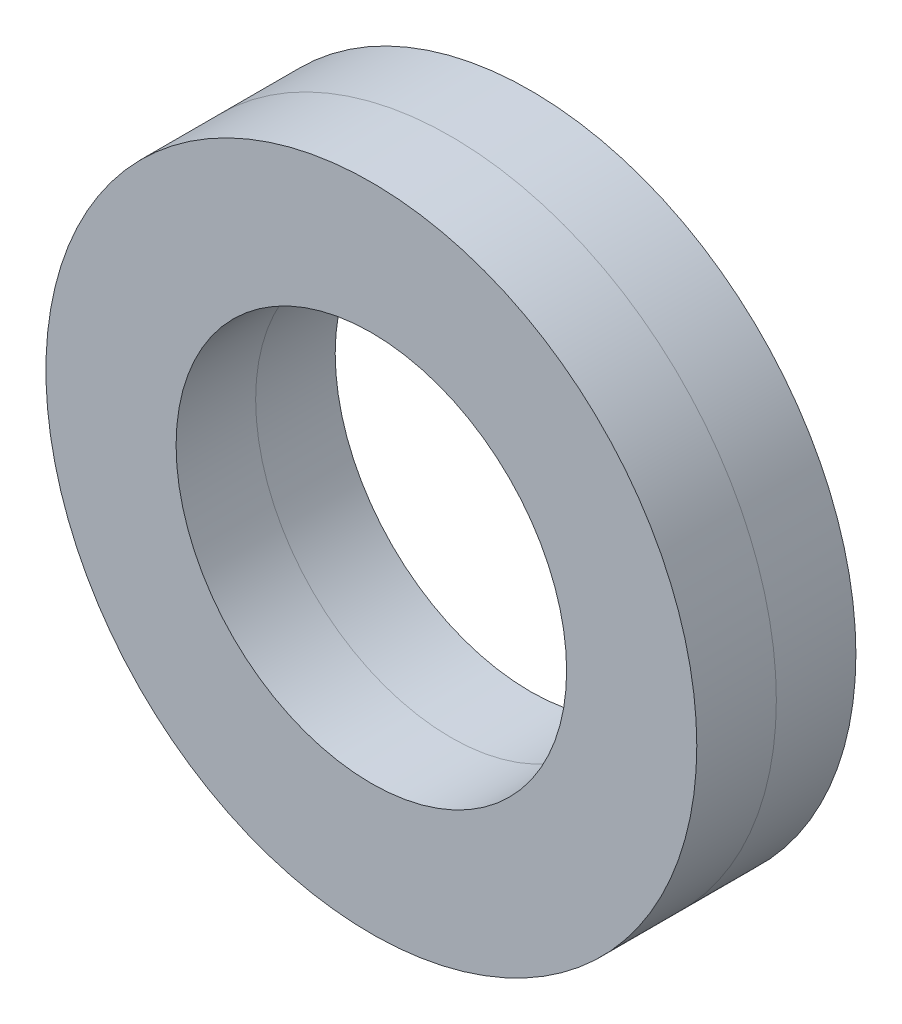
ISO-10303-21;
HEADER;
FILE_DESCRIPTION(('STEP AP214'),'2;1');
FILE_NAME('part.step','',(''),(''),'','','');
FILE_SCHEMA(('AUTOMOTIVE_DESIGN { 1 0 10303 214 1 1 1 1 }'));
ENDSEC;
DATA;
#1=APPLICATION_CONTEXT('core data for automotive mechanical design processes');
#2=APPLICATION_PROTOCOL_DEFINITION('international standard','automotive_design',2000,#1);
#3=PRODUCT_CONTEXT('',#1,'mechanical');
#4=PRODUCT('Part','Part','',(#3));
#5=PRODUCT_RELATED_PRODUCT_CATEGORY('part','',(#4));
#6=PRODUCT_DEFINITION_FORMATION('','',#4);
#7=PRODUCT_DEFINITION_CONTEXT('part definition',#1,'design');
#8=PRODUCT_DEFINITION('design','',#6,#7);
#9=PRODUCT_DEFINITION_SHAPE('','',#8);
#10=(LENGTH_UNIT() NAMED_UNIT(*) SI_UNIT(.MILLI.,.METRE.));
#11=(NAMED_UNIT(*) PLANE_ANGLE_UNIT() SI_UNIT($,.RADIAN.));
#12=(NAMED_UNIT(*) SI_UNIT($,.STERADIAN.) SOLID_ANGLE_UNIT());
#13=UNCERTAINTY_MEASURE_WITH_UNIT(LENGTH_MEASURE(1.E-05),#10,'distance_accuracy_value','');
#14=(GEOMETRIC_REPRESENTATION_CONTEXT(3) GLOBAL_UNCERTAINTY_ASSIGNED_CONTEXT((#13)) GLOBAL_UNIT_ASSIGNED_CONTEXT((#10,
#11,#12)) REPRESENTATION_CONTEXT('',''));
#15=CARTESIAN_POINT('',(0.,0.,0.));
#16=DIRECTION('',(0.,0.,1.));
#17=DIRECTION('',(1.,0.,0.));
#18=AXIS2_PLACEMENT_3D('',#15,#16,#17);
#19=CARTESIAN_POINT('',(0.,0.,0.));
#20=DIRECTION('',(0.,0.,1.));
#21=DIRECTION('',(1.,0.,0.));
#22=AXIS2_PLACEMENT_3D('',#19,#20,#21);
#23=CYLINDRICAL_SURFACE('',#22,2.7);
#24=CARTESIAN_POINT('',(0.,0.,0.));
#25=DIRECTION('',(0.,0.,1.));
#26=DIRECTION('',(1.,0.,0.));
#27=AXIS2_PLACEMENT_3D('',#24,#25,#26);
#28=CIRCLE('',#27,2.7);
#29=CARTESIAN_POINT('',(2.7,0.,0.));
#30=VERTEX_POINT('',#29);
#31=EDGE_CURVE('E78',#30,#30,#28,.T.);
#32=ORIENTED_EDGE('',*,*,#31,.T.);
#33=EDGE_LOOP('',(#32));
#34=FACE_BOUND('',#33,.T.);
#35=CARTESIAN_POINT('',(0.,0.,-1.1));
#36=DIRECTION('',(0.,0.,1.));
#37=DIRECTION('',(1.,0.,0.));
#38=AXIS2_PLACEMENT_3D('',#35,#36,#37);
#39=CIRCLE('',#38,2.7);
#40=CARTESIAN_POINT('',(2.7,0.,-1.1));
#41=VERTEX_POINT('',#40);
#42=EDGE_CURVE('E11',#41,#41,#39,.T.);
#43=ORIENTED_EDGE('',*,*,#42,.F.);
#44=EDGE_LOOP('',(#43));
#45=FACE_BOUND('',#44,.T.);
#46=ADVANCED_FACE('F57',(#34,#45),#23,.F.);
#47=CARTESIAN_POINT('',(0.,0.,-1.1));
#48=DIRECTION('',(0.,0.,-1.));
#49=DIRECTION('',(-1.,0.,0.));
#50=AXIS2_PLACEMENT_3D('',#47,#48,#49);
#51=PLANE('',#50);
#52=ORIENTED_EDGE('',*,*,#42,.T.);
#53=EDGE_LOOP('',(#52));
#54=FACE_BOUND('',#53,.T.);
#55=CARTESIAN_POINT('',(0.,0.,-1.1));
#56=DIRECTION('',(0.,0.,1.));
#57=DIRECTION('',(1.,0.,0.));
#58=AXIS2_PLACEMENT_3D('',#55,#56,#57);
#59=CIRCLE('',#58,4.5);
#60=CARTESIAN_POINT('',(4.5,0.,-1.1));
#61=VERTEX_POINT('',#60);
#62=EDGE_CURVE('E64',#61,#61,#59,.T.);
#63=ORIENTED_EDGE('',*,*,#62,.F.);
#64=EDGE_LOOP('',(#63));
#65=FACE_BOUND('',#64,.T.);
#66=ADVANCED_FACE('F97',(#54,#65),#51,.T.);
#67=CARTESIAN_POINT('',(0.,0.,0.));
#68=DIRECTION('',(0.,0.,1.));
#69=DIRECTION('',(1.,0.,0.));
#70=AXIS2_PLACEMENT_3D('',#67,#68,#69);
#71=CYLINDRICAL_SURFACE('',#70,4.5);
#72=ORIENTED_EDGE('',*,*,#62,.T.);
#73=EDGE_LOOP('',(#72));
#74=FACE_BOUND('',#73,.T.);
#75=CARTESIAN_POINT('',(0.,0.,0.));
#76=DIRECTION('',(0.,0.,1.));
#77=DIRECTION('',(1.,0.,0.));
#78=AXIS2_PLACEMENT_3D('',#75,#76,#77);
#79=CIRCLE('',#78,4.5);
#80=CARTESIAN_POINT('',(4.5,0.,0.));
#81=VERTEX_POINT('',#80);
#82=EDGE_CURVE('E71',#81,#81,#79,.T.);
#83=ORIENTED_EDGE('',*,*,#82,.F.);
#84=EDGE_LOOP('',(#83));
#85=FACE_BOUND('',#84,.T.);
#86=ADVANCED_FACE('F91',(#74,#85),#71,.T.);
#87=CARTESIAN_POINT('',(0.,0.,0.));
#88=DIRECTION('',(0.,0.,1.));
#89=DIRECTION('',(1.,0.,0.));
#90=AXIS2_PLACEMENT_3D('',#87,#88,#89);
#91=PLANE('',#90);
#92=ORIENTED_EDGE('',*,*,#82,.T.);
#93=EDGE_LOOP('',(#92));
#94=FACE_BOUND('',#93,.T.);
#95=ORIENTED_EDGE('',*,*,#31,.F.);
#96=EDGE_LOOP('',(#95));
#97=FACE_BOUND('',#96,.T.);
#98=ADVANCED_FACE('F89',(#94,#97),#91,.T.);
#99=CLOSED_SHELL('',(#46,#66,#86,#98));
#100=MANIFOLD_SOLID_BREP('B2',#99);
#101=CARTESIAN_POINT('',(0.,0.,0.));
#102=DIRECTION('',(0.,0.,1.));
#103=DIRECTION('',(1.,0.,0.));
#104=AXIS2_PLACEMENT_3D('',#101,#102,#103);
#105=CYLINDRICAL_SURFACE('',#104,4.5);
#106=CARTESIAN_POINT('',(0.,0.,0.));
#107=DIRECTION('',(0.,0.,1.));
#108=DIRECTION('',(1.,0.,0.));
#109=AXIS2_PLACEMENT_3D('',#106,#107,#108);
#110=CIRCLE('',#109,4.5);
#111=CARTESIAN_POINT('',(4.5,0.,0.));
#112=VERTEX_POINT('',#111);
#113=EDGE_CURVE('E156',#112,#112,#110,.T.);
#114=ORIENTED_EDGE('',*,*,#113,.T.);
#115=EDGE_LOOP('',(#114));
#116=FACE_BOUND('',#115,.T.);
#117=CARTESIAN_POINT('',(0.,0.,1.1));
#118=DIRECTION('',(0.,0.,1.));
#119=DIRECTION('',(1.,0.,0.));
#120=AXIS2_PLACEMENT_3D('',#117,#118,#119);
#121=CIRCLE('',#120,4.5);
#122=CARTESIAN_POINT('',(4.5,0.,1.1));
#123=VERTEX_POINT('',#122);
#124=EDGE_CURVE('E56',#123,#123,#121,.T.);
#125=ORIENTED_EDGE('',*,*,#124,.F.);
#126=EDGE_LOOP('',(#125));
#127=FACE_BOUND('',#126,.T.);
#128=ADVANCED_FACE('F135',(#116,#127),#105,.T.);
#129=CARTESIAN_POINT('',(0.,0.,1.1));
#130=DIRECTION('',(0.,0.,-1.));
#131=DIRECTION('',(-1.,0.,0.));
#132=AXIS2_PLACEMENT_3D('',#129,#130,#131);
#133=PLANE('',#132);
#134=CARTESIAN_POINT('',(0.,0.,1.1));
#135=DIRECTION('',(0.,0.,1.));
#136=DIRECTION('',(1.,0.,0.));
#137=AXIS2_PLACEMENT_3D('',#134,#135,#136);
#138=CIRCLE('',#137,2.7);
#139=CARTESIAN_POINT('',(2.7,0.,1.1));
#140=VERTEX_POINT('',#139);
#141=EDGE_CURVE('E142',#140,#140,#138,.T.);
#142=ORIENTED_EDGE('',*,*,#141,.F.);
#143=EDGE_LOOP('',(#142));
#144=FACE_BOUND('',#143,.T.);
#145=ORIENTED_EDGE('',*,*,#124,.T.);
#146=EDGE_LOOP('',(#145));
#147=FACE_BOUND('',#146,.T.);
#148=ADVANCED_FACE('F175',(#144,#147),#133,.F.);
#149=CARTESIAN_POINT('',(0.,0.,0.));
#150=DIRECTION('',(0.,0.,1.));
#151=DIRECTION('',(1.,0.,0.));
#152=AXIS2_PLACEMENT_3D('',#149,#150,#151);
#153=CYLINDRICAL_SURFACE('',#152,2.7);
#154=ORIENTED_EDGE('',*,*,#141,.T.);
#155=EDGE_LOOP('',(#154));
#156=FACE_BOUND('',#155,.T.);
#157=CARTESIAN_POINT('',(0.,0.,0.));
#158=DIRECTION('',(0.,0.,1.));
#159=DIRECTION('',(1.,0.,0.));
#160=AXIS2_PLACEMENT_3D('',#157,#158,#159);
#161=CIRCLE('',#160,2.7);
#162=CARTESIAN_POINT('',(2.7,0.,0.));
#163=VERTEX_POINT('',#162);
#164=EDGE_CURVE('E149',#163,#163,#161,.T.);
#165=ORIENTED_EDGE('',*,*,#164,.F.);
#166=EDGE_LOOP('',(#165));
#167=FACE_BOUND('',#166,.T.);
#168=ADVANCED_FACE('F170',(#156,#167),#153,.F.);
#169=CARTESIAN_POINT('',(0.,0.,0.));
#170=DIRECTION('',(0.,0.,1.));
#171=DIRECTION('',(1.,0.,0.));
#172=AXIS2_PLACEMENT_3D('',#169,#170,#171);
#173=PLANE('',#172);
#174=ORIENTED_EDGE('',*,*,#113,.F.);
#175=EDGE_LOOP('',(#174));
#176=FACE_BOUND('',#175,.T.);
#177=ORIENTED_EDGE('',*,*,#164,.T.);
#178=EDGE_LOOP('',(#177));
#179=FACE_BOUND('',#178,.T.);
#180=ADVANCED_FACE('F167',(#176,#179),#173,.F.);
#181=CLOSED_SHELL('',(#128,#148,#168,#180));
#182=MANIFOLD_SOLID_BREP('B6',#181);
#183=ADVANCED_BREP_SHAPE_REPRESENTATION('',(#18,#100,#182),#14);
#184=SHAPE_DEFINITION_REPRESENTATION(#9,#183);
ENDSEC;
END-ISO-10303-21;
